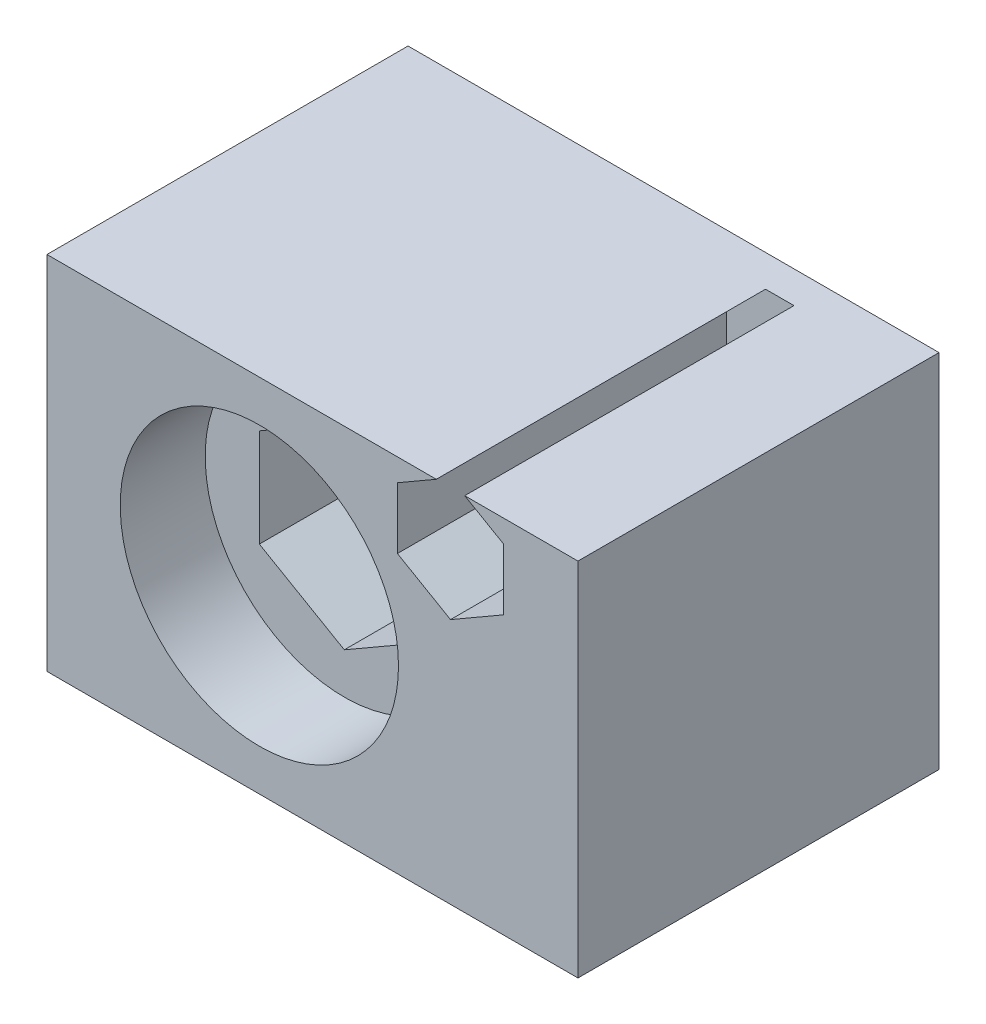
ISO-10303-21;
HEADER;
FILE_DESCRIPTION(('STEP AP214'),'2;1');
FILE_NAME('part.step','',(''),(''),'','','');
FILE_SCHEMA(('AUTOMOTIVE_DESIGN { 1 0 10303 214 1 1 1 1 }'));
ENDSEC;
DATA;
#1=APPLICATION_CONTEXT('core data for automotive mechanical design processes');
#2=APPLICATION_PROTOCOL_DEFINITION('international standard','automotive_design',2000,#1);
#3=PRODUCT_CONTEXT('',#1,'mechanical');
#4=PRODUCT('Part','Part','',(#3));
#5=PRODUCT_RELATED_PRODUCT_CATEGORY('part','',(#4));
#6=PRODUCT_DEFINITION_FORMATION('','',#4);
#7=PRODUCT_DEFINITION_CONTEXT('part definition',#1,'design');
#8=PRODUCT_DEFINITION('design','',#6,#7);
#9=PRODUCT_DEFINITION_SHAPE('','',#8);
#10=(LENGTH_UNIT() NAMED_UNIT(*) SI_UNIT(.MILLI.,.METRE.));
#11=(NAMED_UNIT(*) PLANE_ANGLE_UNIT() SI_UNIT($,.RADIAN.));
#12=(NAMED_UNIT(*) SI_UNIT($,.STERADIAN.) SOLID_ANGLE_UNIT());
#13=UNCERTAINTY_MEASURE_WITH_UNIT(LENGTH_MEASURE(1.E-05),#10,'distance_accuracy_value','');
#14=(GEOMETRIC_REPRESENTATION_CONTEXT(3) GLOBAL_UNCERTAINTY_ASSIGNED_CONTEXT((#13)) GLOBAL_UNIT_ASSIGNED_CONTEXT((#10,
#11,#12)) REPRESENTATION_CONTEXT('',''));
#15=CARTESIAN_POINT('',(0.,0.,0.));
#16=DIRECTION('',(0.,0.,1.));
#17=DIRECTION('',(1.,0.,0.));
#18=AXIS2_PLACEMENT_3D('',#15,#16,#17);
#19=CARTESIAN_POINT('',(10.,9.,-4.5));
#20=DIRECTION('',(0.,0.,1.));
#21=DIRECTION('',(1.,0.,0.));
#22=AXIS2_PLACEMENT_3D('',#19,#20,#21);
#23=CYLINDRICAL_SURFACE('',#22,6.55);
#24=CARTESIAN_POINT('',(10.,9.,-4.5));
#25=DIRECTION('',(0.,0.,1.));
#26=DIRECTION('',(1.,0.,0.));
#27=AXIS2_PLACEMENT_3D('',#24,#25,#26);
#28=CIRCLE('',#27,6.55);
#29=CARTESIAN_POINT('',(16.55,9.,-4.5));
#30=VERTEX_POINT('',#29);
#31=EDGE_CURVE('E284',#30,#30,#28,.T.);
#32=ORIENTED_EDGE('',*,*,#31,.F.);
#33=EDGE_LOOP('',(#32));
#34=FACE_BOUND('',#33,.T.);
#35=CARTESIAN_POINT('',(10.,9.,-0.499999999999999));
#36=DIRECTION('',(0.,0.,1.));
#37=DIRECTION('',(0.,-1.,0.));
#38=AXIS2_PLACEMENT_3D('',#35,#36,#37);
#39=CIRCLE('',#38,6.55);
#40=CARTESIAN_POINT('',(10.,2.45,-0.499999999999997));
#41=VERTEX_POINT('',#40);
#42=EDGE_CURVE('E207',#41,#41,#39,.F.);
#43=ORIENTED_EDGE('',*,*,#42,.F.);
#44=EDGE_LOOP('',(#43));
#45=FACE_BOUND('',#44,.T.);
#46=ADVANCED_FACE('F37',(#34,#45),#23,.F.);
#47=CARTESIAN_POINT('',(10.,9.,-4.5));
#48=DIRECTION('',(0.,0.,1.));
#49=DIRECTION('',(1.,0.,0.));
#50=AXIS2_PLACEMENT_3D('',#47,#48,#49);
#51=PLANE('',#50);
#52=DIRECTION('',(-0.866025403784439,0.5,0.));
#53=VECTOR('',#52,1.);
#54=CARTESIAN_POINT('',(14.,11.3094010767585,-4.5));
#55=LINE('',#54,#53);
#56=CARTESIAN_POINT('',(14.,11.3094010767585,-4.5));
#57=VERTEX_POINT('',#56);
#58=CARTESIAN_POINT('',(10.,13.618802153517,-4.5));
#59=VERTEX_POINT('',#58);
#60=EDGE_CURVE('E231',#57,#59,#55,.T.);
#61=ORIENTED_EDGE('',*,*,#60,.F.);
#62=DIRECTION('',(0.,1.,0.));
#63=VECTOR('',#62,1.);
#64=CARTESIAN_POINT('',(14.,6.6905989232415,-4.5));
#65=LINE('',#64,#63);
#66=CARTESIAN_POINT('',(14.,6.6905989232415,-4.5));
#67=VERTEX_POINT('',#66);
#68=EDGE_CURVE('E268',#67,#57,#65,.T.);
#69=ORIENTED_EDGE('',*,*,#68,.F.);
#70=DIRECTION('',(0.866025403784439,0.5,0.));
#71=VECTOR('',#70,1.);
#72=CARTESIAN_POINT('',(10.,4.381197846483,-4.5));
#73=LINE('',#72,#71);
#74=CARTESIAN_POINT('',(10.,4.381197846483,-4.5));
#75=VERTEX_POINT('',#74);
#76=EDGE_CURVE('E265',#75,#67,#73,.T.);
#77=ORIENTED_EDGE('',*,*,#76,.F.);
#78=DIRECTION('',(0.866025403784439,-0.5,0.));
#79=VECTOR('',#78,1.);
#80=CARTESIAN_POINT('',(6.,6.6905989232415,-4.5));
#81=LINE('',#80,#79);
#82=CARTESIAN_POINT('',(6.,6.6905989232415,-4.5));
#83=VERTEX_POINT('',#82);
#84=EDGE_CURVE('E262',#83,#75,#81,.T.);
#85=ORIENTED_EDGE('',*,*,#84,.F.);
#86=DIRECTION('',(0.,-1.,0.));
#87=VECTOR('',#86,1.);
#88=CARTESIAN_POINT('',(6.,11.3094010767585,-4.5));
#89=LINE('',#88,#87);
#90=CARTESIAN_POINT('',(6.,11.3094010767585,-4.5));
#91=VERTEX_POINT('',#90);
#92=EDGE_CURVE('E259',#91,#83,#89,.T.);
#93=ORIENTED_EDGE('',*,*,#92,.F.);
#94=DIRECTION('',(-0.866025403784438,-0.5,0.));
#95=VECTOR('',#94,1.);
#96=CARTESIAN_POINT('',(10.,13.618802153517,-4.5));
#97=LINE('',#96,#95);
#98=EDGE_CURVE('E256',#59,#91,#97,.T.);
#99=ORIENTED_EDGE('',*,*,#98,.F.);
#100=EDGE_LOOP('',(#61,#69,#77,#85,#93,#99));
#101=FACE_BOUND('',#100,.T.);
#102=ORIENTED_EDGE('',*,*,#31,.T.);
#103=EDGE_LOOP('',(#102));
#104=FACE_BOUND('',#103,.T.);
#105=ADVANCED_FACE('F333',(#101,#104),#51,.T.);
#106=CARTESIAN_POINT('',(14.,11.3094010767585,-30.2202018532156));
#107=DIRECTION('',(0.5,0.866025403784439,0.));
#108=DIRECTION('',(-0.866025403784439,0.5,0.));
#109=AXIS2_PLACEMENT_3D('',#106,#107,#108);
#110=PLANE('',#109);
#111=DIRECTION('',(0.866025403784439,-0.5,0.));
#112=VECTOR('',#111,1.);
#113=CARTESIAN_POINT('',(14.,11.3094010767585,-16.2));
#114=LINE('',#113,#112);
#115=CARTESIAN_POINT('',(10.,13.618802153517,-16.2));
#116=VERTEX_POINT('',#115);
#117=CARTESIAN_POINT('',(14.,11.3094010767585,-16.2));
#118=VERTEX_POINT('',#117);
#119=EDGE_CURVE('E252',#116,#118,#114,.T.);
#120=ORIENTED_EDGE('',*,*,#119,.T.);
#121=DIRECTION('',(0.,0.,1.));
#122=VECTOR('',#121,1.);
#123=CARTESIAN_POINT('',(14.,11.3094010767585,-30.2202018532156));
#124=LINE('',#123,#122);
#125=EDGE_CURVE('E246',#118,#57,#124,.T.);
#126=ORIENTED_EDGE('',*,*,#125,.T.);
#127=ORIENTED_EDGE('',*,*,#60,.T.);
#128=DIRECTION('',(0.,0.,1.));
#129=VECTOR('',#128,1.);
#130=CARTESIAN_POINT('',(10.,13.618802153517,-30.2202018532156));
#131=LINE('',#130,#129);
#132=EDGE_CURVE('E271',#116,#59,#131,.T.);
#133=ORIENTED_EDGE('',*,*,#132,.F.);
#134=EDGE_LOOP('',(#120,#126,#127,#133));
#135=FACE_BOUND('',#134,.T.);
#136=ADVANCED_FACE('F339',(#135),#110,.F.);
#137=CARTESIAN_POINT('',(14.,6.6905989232415,-30.2202018532156));
#138=DIRECTION('',(1.,0.,0.));
#139=DIRECTION('',(0.,0.,-1.));
#140=AXIS2_PLACEMENT_3D('',#137,#138,#139);
#141=PLANE('',#140);
#142=DIRECTION('',(0.,-1.,0.));
#143=VECTOR('',#142,1.);
#144=CARTESIAN_POINT('',(14.,6.6905989232415,-16.2));
#145=LINE('',#144,#143);
#146=CARTESIAN_POINT('',(14.,6.6905989232415,-16.2));
#147=VERTEX_POINT('',#146);
#148=EDGE_CURVE('E250',#118,#147,#145,.T.);
#149=ORIENTED_EDGE('',*,*,#148,.T.);
#150=DIRECTION('',(0.,0.,1.));
#151=VECTOR('',#150,1.);
#152=CARTESIAN_POINT('',(14.,6.6905989232415,-30.2202018532156));
#153=LINE('',#152,#151);
#154=EDGE_CURVE('E273',#147,#67,#153,.T.);
#155=ORIENTED_EDGE('',*,*,#154,.T.);
#156=ORIENTED_EDGE('',*,*,#68,.T.);
#157=ORIENTED_EDGE('',*,*,#125,.F.);
#158=EDGE_LOOP('',(#149,#155,#156,#157));
#159=FACE_BOUND('',#158,.T.);
#160=ADVANCED_FACE('F489',(#159),#141,.F.);
#161=CARTESIAN_POINT('',(10.,4.381197846483,-30.2202018532156));
#162=DIRECTION('',(0.5,-0.866025403784439,0.));
#163=DIRECTION('',(0.866025403784439,0.5,0.));
#164=AXIS2_PLACEMENT_3D('',#161,#162,#163);
#165=PLANE('',#164);
#166=DIRECTION('',(-0.866025403784439,-0.5,0.));
#167=VECTOR('',#166,1.);
#168=CARTESIAN_POINT('',(10.,4.381197846483,-16.2));
#169=LINE('',#168,#167);
#170=CARTESIAN_POINT('',(10.,4.381197846483,-16.2));
#171=VERTEX_POINT('',#170);
#172=EDGE_CURVE('E248',#147,#171,#169,.T.);
#173=ORIENTED_EDGE('',*,*,#172,.T.);
#174=DIRECTION('',(0.,0.,1.));
#175=VECTOR('',#174,1.);
#176=CARTESIAN_POINT('',(10.,4.381197846483,-30.2202018532156));
#177=LINE('',#176,#175);
#178=EDGE_CURVE('E275',#171,#75,#177,.T.);
#179=ORIENTED_EDGE('',*,*,#178,.T.);
#180=ORIENTED_EDGE('',*,*,#76,.T.);
#181=ORIENTED_EDGE('',*,*,#154,.F.);
#182=EDGE_LOOP('',(#173,#179,#180,#181));
#183=FACE_BOUND('',#182,.T.);
#184=ADVANCED_FACE('F481',(#183),#165,.F.);
#185=CARTESIAN_POINT('',(6.,6.6905989232415,-30.2202018532156));
#186=DIRECTION('',(-0.5,-0.866025403784439,0.));
#187=DIRECTION('',(0.866025403784439,-0.5,0.));
#188=AXIS2_PLACEMENT_3D('',#185,#186,#187);
#189=PLANE('',#188);
#190=DIRECTION('',(-0.866025403784439,0.5,0.));
#191=VECTOR('',#190,1.);
#192=CARTESIAN_POINT('',(6.,6.6905989232415,-16.2));
#193=LINE('',#192,#191);
#194=CARTESIAN_POINT('',(6.,6.6905989232415,-16.2));
#195=VERTEX_POINT('',#194);
#196=EDGE_CURVE('E245',#171,#195,#193,.T.);
#197=ORIENTED_EDGE('',*,*,#196,.T.);
#198=DIRECTION('',(0.,0.,1.));
#199=VECTOR('',#198,1.);
#200=CARTESIAN_POINT('',(6.,6.6905989232415,-30.2202018532156));
#201=LINE('',#200,#199);
#202=EDGE_CURVE('E277',#195,#83,#201,.T.);
#203=ORIENTED_EDGE('',*,*,#202,.T.);
#204=ORIENTED_EDGE('',*,*,#84,.T.);
#205=ORIENTED_EDGE('',*,*,#178,.F.);
#206=EDGE_LOOP('',(#197,#203,#204,#205));
#207=FACE_BOUND('',#206,.T.);
#208=ADVANCED_FACE('F473',(#207),#189,.F.);
#209=CARTESIAN_POINT('',(6.,11.3094010767585,-30.2202018532156));
#210=DIRECTION('',(-1.,0.,0.));
#211=DIRECTION('',(0.,0.,1.));
#212=AXIS2_PLACEMENT_3D('',#209,#210,#211);
#213=PLANE('',#212);
#214=DIRECTION('',(0.,1.,0.));
#215=VECTOR('',#214,1.);
#216=CARTESIAN_POINT('',(6.,11.3094010767585,-16.2));
#217=LINE('',#216,#215);
#218=CARTESIAN_POINT('',(6.,11.3094010767585,-16.2));
#219=VERTEX_POINT('',#218);
#220=EDGE_CURVE('E243',#195,#219,#217,.T.);
#221=ORIENTED_EDGE('',*,*,#220,.T.);
#222=DIRECTION('',(0.,0.,1.));
#223=VECTOR('',#222,1.);
#224=CARTESIAN_POINT('',(6.,11.3094010767585,-30.2202018532156));
#225=LINE('',#224,#223);
#226=EDGE_CURVE('E279',#219,#91,#225,.T.);
#227=ORIENTED_EDGE('',*,*,#226,.T.);
#228=ORIENTED_EDGE('',*,*,#92,.T.);
#229=ORIENTED_EDGE('',*,*,#202,.F.);
#230=EDGE_LOOP('',(#221,#227,#228,#229));
#231=FACE_BOUND('',#230,.T.);
#232=ADVANCED_FACE('F466',(#231),#213,.F.);
#233=CARTESIAN_POINT('',(10.,13.618802153517,-30.2202018532156));
#234=DIRECTION('',(-0.5,0.866025403784438,0.));
#235=DIRECTION('',(-0.866025403784438,-0.5,0.));
#236=AXIS2_PLACEMENT_3D('',#233,#234,#235);
#237=PLANE('',#236);
#238=DIRECTION('',(0.866025403784438,0.5,0.));
#239=VECTOR('',#238,1.);
#240=CARTESIAN_POINT('',(10.,13.618802153517,-16.2));
#241=LINE('',#240,#239);
#242=EDGE_CURVE('E254',#219,#116,#241,.T.);
#243=ORIENTED_EDGE('',*,*,#242,.T.);
#244=ORIENTED_EDGE('',*,*,#132,.T.);
#245=ORIENTED_EDGE('',*,*,#98,.T.);
#246=ORIENTED_EDGE('',*,*,#226,.F.);
#247=EDGE_LOOP('',(#243,#244,#245,#246));
#248=FACE_BOUND('',#247,.T.);
#249=ADVANCED_FACE('F458',(#248),#237,.F.);
#250=CARTESIAN_POINT('',(25.,0.,-16.2));
#251=DIRECTION('',(0.,0.,1.));
#252=DIRECTION('',(1.,0.,0.));
#253=AXIS2_PLACEMENT_3D('',#250,#251,#252);
#254=PLANE('',#253);
#255=ORIENTED_EDGE('',*,*,#119,.F.);
#256=ORIENTED_EDGE('',*,*,#242,.F.);
#257=ORIENTED_EDGE('',*,*,#220,.F.);
#258=ORIENTED_EDGE('',*,*,#196,.F.);
#259=ORIENTED_EDGE('',*,*,#172,.F.);
#260=ORIENTED_EDGE('',*,*,#148,.F.);
#261=EDGE_LOOP('',(#255,#256,#257,#258,#259,#260));
#262=FACE_BOUND('',#261,.T.);
#263=ADVANCED_FACE('F438',(#262),#254,.T.);
#264=CARTESIAN_POINT('',(25.,17.5,-0.5));
#265=DIRECTION('',(0.,0.,1.));
#266=DIRECTION('',(0.,-1.,0.));
#267=AXIS2_PLACEMENT_3D('',#264,#265,#266);
#268=PLANE('',#267);
#269=DIRECTION('',(0.866025403784439,-0.5,0.));
#270=VECTOR('',#269,1.);
#271=CARTESIAN_POINT('',(21.5000000000016,16.4433756729741,-0.5));
#272=LINE('',#271,#270);
#273=CARTESIAN_POINT('',(19.6698729810795,17.5,-0.500000000000001));
#274=VERTEX_POINT('',#273);
#275=CARTESIAN_POINT('',(21.5000000000016,16.4433756729741,-0.500000000000001));
#276=VERTEX_POINT('',#275);
#277=EDGE_CURVE('E205',#274,#276,#272,.T.);
#278=ORIENTED_EDGE('',*,*,#277,.T.);
#279=DIRECTION('',(0.,-1.,0.));
#280=VECTOR('',#279,1.);
#281=CARTESIAN_POINT('',(21.5000000000016,13.556624327026,-0.5));
#282=LINE('',#281,#280);
#283=CARTESIAN_POINT('',(21.5000000000016,13.556624327026,-0.499999999999999));
#284=VERTEX_POINT('',#283);
#285=EDGE_CURVE('E203',#276,#284,#282,.T.);
#286=ORIENTED_EDGE('',*,*,#285,.T.);
#287=DIRECTION('',(-0.866025403784438,-0.5,0.));
#288=VECTOR('',#287,1.);
#289=CARTESIAN_POINT('',(19.0000000000016,12.1132486540519,-0.499999999999999));
#290=LINE('',#289,#288);
#291=CARTESIAN_POINT('',(19.0000000000016,12.1132486540519,-0.5));
#292=VERTEX_POINT('',#291);
#293=EDGE_CURVE('E201',#284,#292,#290,.T.);
#294=ORIENTED_EDGE('',*,*,#293,.T.);
#295=DIRECTION('',(-0.866025403784439,0.5,0.));
#296=VECTOR('',#295,1.);
#297=CARTESIAN_POINT('',(16.5000000000016,13.556624327026,-0.5));
#298=LINE('',#297,#296);
#299=CARTESIAN_POINT('',(16.5000000000016,13.556624327026,-0.5));
#300=VERTEX_POINT('',#299);
#301=EDGE_CURVE('E199',#292,#300,#298,.T.);
#302=ORIENTED_EDGE('',*,*,#301,.T.);
#303=DIRECTION('',(0.,1.,0.));
#304=VECTOR('',#303,1.);
#305=CARTESIAN_POINT('',(16.5000000000016,16.4433756729741,-0.5));
#306=LINE('',#305,#304);
#307=CARTESIAN_POINT('',(16.5000000000016,16.4433756729741,-0.5));
#308=VERTEX_POINT('',#307);
#309=EDGE_CURVE('E197',#300,#308,#306,.T.);
#310=ORIENTED_EDGE('',*,*,#309,.T.);
#311=DIRECTION('',(0.866025403784438,0.500000000000001,0.));
#312=VECTOR('',#311,1.);
#313=CARTESIAN_POINT('',(19.0000000000016,17.8867513459482,-0.5));
#314=LINE('',#313,#312);
#315=CARTESIAN_POINT('',(18.3301270189237,17.5,-0.5));
#316=VERTEX_POINT('',#315);
#317=EDGE_CURVE('E12',#308,#316,#314,.T.);
#318=ORIENTED_EDGE('',*,*,#317,.T.);
#319=DIRECTION('',(-1.,0.,0.));
#320=VECTOR('',#319,1.);
#321=CARTESIAN_POINT('',(25.,17.5,-0.5));
#322=LINE('',#321,#320);
#323=CARTESIAN_POINT('',(0.,17.5,-0.5));
#324=VERTEX_POINT('',#323);
#325=EDGE_CURVE('E164',#316,#324,#322,.T.);
#326=ORIENTED_EDGE('',*,*,#325,.T.);
#327=DIRECTION('',(0.,1.,0.));
#328=VECTOR('',#327,1.);
#329=CARTESIAN_POINT('',(0.,17.5,-0.5));
#330=LINE('',#329,#328);
#331=CARTESIAN_POINT('',(0.,0.5,-0.499999999999997));
#332=VERTEX_POINT('',#331);
#333=EDGE_CURVE('E60',#332,#324,#330,.T.);
#334=ORIENTED_EDGE('',*,*,#333,.F.);
#335=DIRECTION('',(-1.,0.,0.));
#336=VECTOR('',#335,1.);
#337=CARTESIAN_POINT('',(25.,0.5,-0.499999999999997));
#338=LINE('',#337,#336);
#339=CARTESIAN_POINT('',(25.,0.5,-0.499999999999997));
#340=VERTEX_POINT('',#339);
#341=EDGE_CURVE('E170',#340,#332,#338,.T.);
#342=ORIENTED_EDGE('',*,*,#341,.F.);
#343=DIRECTION('',(0.,1.,0.));
#344=VECTOR('',#343,1.);
#345=CARTESIAN_POINT('',(25.,17.5,-0.5));
#346=LINE('',#345,#344);
#347=CARTESIAN_POINT('',(25.,17.5,-0.5));
#348=VERTEX_POINT('',#347);
#349=EDGE_CURVE('E167',#340,#348,#346,.T.);
#350=ORIENTED_EDGE('',*,*,#349,.T.);
#351=EDGE_CURVE('E155',#348,#274,#322,.T.);
#352=ORIENTED_EDGE('',*,*,#351,.T.);
#353=EDGE_LOOP('',(#278,#286,#294,#302,#310,#318,#326,#334,#342,#350,#352));
#354=FACE_BOUND('',#353,.T.);
#355=ORIENTED_EDGE('',*,*,#42,.T.);
#356=EDGE_LOOP('',(#355));
#357=FACE_BOUND('',#356,.T.);
#358=ADVANCED_FACE('F168',(#354,#357),#268,.T.);
#359=CARTESIAN_POINT('',(25.,17.5,-17.5));
#360=DIRECTION('',(0.,1.,0.));
#361=DIRECTION('',(0.,0.,1.));
#362=AXIS2_PLACEMENT_3D('',#359,#360,#361);
#363=PLANE('',#362);
#364=DIRECTION('',(0.,0.,1.));
#365=VECTOR('',#364,1.);
#366=CARTESIAN_POINT('',(19.6698729810795,17.5,-16.));
#367=LINE('',#366,#365);
#368=CARTESIAN_POINT('',(19.6698729810795,17.5,-16.));
#369=VERTEX_POINT('',#368);
#370=EDGE_CURVE('E161',#369,#274,#367,.T.);
#371=ORIENTED_EDGE('',*,*,#370,.T.);
#372=ORIENTED_EDGE('',*,*,#351,.F.);
#373=DIRECTION('',(0.,0.,-1.));
#374=VECTOR('',#373,1.);
#375=CARTESIAN_POINT('',(25.,17.5,-17.5));
#376=LINE('',#375,#374);
#377=CARTESIAN_POINT('',(25.,17.5,-17.5));
#378=VERTEX_POINT('',#377);
#379=EDGE_CURVE('E159',#348,#378,#376,.T.);
#380=ORIENTED_EDGE('',*,*,#379,.T.);
#381=DIRECTION('',(-1.,0.,0.));
#382=VECTOR('',#381,1.);
#383=CARTESIAN_POINT('',(25.,17.5,-17.5));
#384=LINE('',#383,#382);
#385=CARTESIAN_POINT('',(0.,17.5,-17.5));
#386=VERTEX_POINT('',#385);
#387=EDGE_CURVE('E163',#378,#386,#384,.T.);
#388=ORIENTED_EDGE('',*,*,#387,.T.);
#389=DIRECTION('',(0.,0.,-1.));
#390=VECTOR('',#389,1.);
#391=CARTESIAN_POINT('',(0.,17.5,-17.5));
#392=LINE('',#391,#390);
#393=EDGE_CURVE('E189',#324,#386,#392,.T.);
#394=ORIENTED_EDGE('',*,*,#393,.F.);
#395=ORIENTED_EDGE('',*,*,#325,.F.);
#396=DIRECTION('',(0.,0.,-1.));
#397=VECTOR('',#396,1.);
#398=CARTESIAN_POINT('',(18.3301270189238,17.5,-16.));
#399=LINE('',#398,#397);
#400=CARTESIAN_POINT('',(18.3301270189238,17.5,-16.));
#401=VERTEX_POINT('',#400);
#402=EDGE_CURVE('E192',#316,#401,#399,.T.);
#403=ORIENTED_EDGE('',*,*,#402,.T.);
#404=DIRECTION('',(-1.,0.,0.));
#405=VECTOR('',#404,1.);
#406=CARTESIAN_POINT('',(0.,17.5,-16.));
#407=LINE('',#406,#405);
#408=EDGE_CURVE('E45',#369,#401,#407,.T.);
#409=ORIENTED_EDGE('',*,*,#408,.F.);
#410=EDGE_LOOP('',(#371,#372,#380,#388,#394,#395,#403,#409));
#411=FACE_BOUND('',#410,.T.);
#412=ADVANCED_FACE('F157',(#411),#363,.T.);
#413=CARTESIAN_POINT('',(25.,17.5,-17.5));
#414=DIRECTION('',(0.,0.,-1.));
#415=DIRECTION('',(0.,1.,0.));
#416=AXIS2_PLACEMENT_3D('',#413,#414,#415);
#417=PLANE('',#416);
#418=DIRECTION('',(0.,-1.,0.));
#419=VECTOR('',#418,1.);
#420=CARTESIAN_POINT('',(0.,17.5,-17.5));
#421=LINE('',#420,#419);
#422=CARTESIAN_POINT('',(0.,0.5,-17.5));
#423=VERTEX_POINT('',#422);
#424=EDGE_CURVE('E182',#386,#423,#421,.T.);
#425=ORIENTED_EDGE('',*,*,#424,.F.);
#426=ORIENTED_EDGE('',*,*,#387,.F.);
#427=DIRECTION('',(0.,-1.,0.));
#428=VECTOR('',#427,1.);
#429=CARTESIAN_POINT('',(25.,17.5,-17.5));
#430=LINE('',#429,#428);
#431=CARTESIAN_POINT('',(25.,0.5,-17.5));
#432=VERTEX_POINT('',#431);
#433=EDGE_CURVE('E52',#378,#432,#430,.T.);
#434=ORIENTED_EDGE('',*,*,#433,.T.);
#435=DIRECTION('',(-1.,0.,0.));
#436=VECTOR('',#435,1.);
#437=CARTESIAN_POINT('',(25.,0.5,-17.5));
#438=LINE('',#437,#436);
#439=EDGE_CURVE('E177',#432,#423,#438,.T.);
#440=ORIENTED_EDGE('',*,*,#439,.T.);
#441=EDGE_LOOP('',(#425,#426,#434,#440));
#442=FACE_BOUND('',#441,.T.);
#443=ADVANCED_FACE('F322',(#442),#417,.T.);
#444=CARTESIAN_POINT('',(25.,0.5,-17.5));
#445=DIRECTION('',(0.,-1.,0.));
#446=DIRECTION('',(0.,0.,-1.));
#447=AXIS2_PLACEMENT_3D('',#444,#445,#446);
#448=PLANE('',#447);
#449=DIRECTION('',(0.,0.,1.));
#450=VECTOR('',#449,1.);
#451=CARTESIAN_POINT('',(0.,0.5,-17.5));
#452=LINE('',#451,#450);
#453=EDGE_CURVE('E185',#423,#332,#452,.T.);
#454=ORIENTED_EDGE('',*,*,#453,.F.);
#455=ORIENTED_EDGE('',*,*,#439,.F.);
#456=DIRECTION('',(0.,0.,1.));
#457=VECTOR('',#456,1.);
#458=CARTESIAN_POINT('',(25.,0.5,-17.5));
#459=LINE('',#458,#457);
#460=EDGE_CURVE('E174',#432,#340,#459,.T.);
#461=ORIENTED_EDGE('',*,*,#460,.T.);
#462=ORIENTED_EDGE('',*,*,#341,.T.);
#463=EDGE_LOOP('',(#454,#455,#461,#462));
#464=FACE_BOUND('',#463,.T.);
#465=ADVANCED_FACE('F320',(#464),#448,.T.);
#466=CARTESIAN_POINT('',(0.,0.,0.));
#467=DIRECTION('',(-1.,0.,0.));
#468=DIRECTION('',(0.,0.,1.));
#469=AXIS2_PLACEMENT_3D('',#466,#467,#468);
#470=PLANE('',#469);
#471=ORIENTED_EDGE('',*,*,#393,.T.);
#472=ORIENTED_EDGE('',*,*,#424,.T.);
#473=ORIENTED_EDGE('',*,*,#453,.T.);
#474=ORIENTED_EDGE('',*,*,#333,.T.);
#475=EDGE_LOOP('',(#471,#472,#473,#474));
#476=FACE_BOUND('',#475,.T.);
#477=ADVANCED_FACE('F39',(#476),#470,.T.);
#478=CARTESIAN_POINT('',(25.,0.,0.));
#479=DIRECTION('',(-1.,0.,0.));
#480=DIRECTION('',(0.,0.,1.));
#481=AXIS2_PLACEMENT_3D('',#478,#479,#480);
#482=PLANE('',#481);
#483=ORIENTED_EDGE('',*,*,#433,.F.);
#484=ORIENTED_EDGE('',*,*,#379,.F.);
#485=ORIENTED_EDGE('',*,*,#349,.F.);
#486=ORIENTED_EDGE('',*,*,#460,.F.);
#487=EDGE_LOOP('',(#483,#484,#485,#486));
#488=FACE_BOUND('',#487,.T.);
#489=ADVANCED_FACE('F176',(#488),#482,.F.);
#490=CARTESIAN_POINT('',(0.,0.,-16.));
#491=DIRECTION('',(0.,0.,1.));
#492=DIRECTION('',(1.,0.,0.));
#493=AXIS2_PLACEMENT_3D('',#490,#491,#492);
#494=PLANE('',#493);
#495=DIRECTION('',(-0.866025403784439,0.5,0.));
#496=VECTOR('',#495,1.);
#497=CARTESIAN_POINT('',(21.5000000000016,16.4433756729741,-16.));
#498=LINE('',#497,#496);
#499=CARTESIAN_POINT('',(21.5000000000016,16.4433756729741,-16.));
#500=VERTEX_POINT('',#499);
#501=EDGE_CURVE('E210',#500,#369,#498,.T.);
#502=ORIENTED_EDGE('',*,*,#501,.T.);
#503=ORIENTED_EDGE('',*,*,#408,.T.);
#504=DIRECTION('',(-0.866025403784438,-0.500000000000001,0.));
#505=VECTOR('',#504,1.);
#506=CARTESIAN_POINT('',(19.0000000000016,17.8867513459482,-16.));
#507=LINE('',#506,#505);
#508=CARTESIAN_POINT('',(16.5000000000016,16.4433756729741,-16.));
#509=VERTEX_POINT('',#508);
#510=EDGE_CURVE('E213',#401,#509,#507,.T.);
#511=ORIENTED_EDGE('',*,*,#510,.T.);
#512=DIRECTION('',(0.,-1.,0.));
#513=VECTOR('',#512,1.);
#514=CARTESIAN_POINT('',(16.5000000000016,16.4433756729741,-16.));
#515=LINE('',#514,#513);
#516=CARTESIAN_POINT('',(16.5000000000016,13.556624327026,-16.));
#517=VERTEX_POINT('',#516);
#518=EDGE_CURVE('E215',#509,#517,#515,.T.);
#519=ORIENTED_EDGE('',*,*,#518,.T.);
#520=DIRECTION('',(0.866025403784439,-0.5,0.));
#521=VECTOR('',#520,1.);
#522=CARTESIAN_POINT('',(16.5000000000016,13.556624327026,-16.));
#523=LINE('',#522,#521);
#524=CARTESIAN_POINT('',(19.0000000000016,12.1132486540519,-16.));
#525=VERTEX_POINT('',#524);
#526=EDGE_CURVE('E218',#517,#525,#523,.T.);
#527=ORIENTED_EDGE('',*,*,#526,.T.);
#528=DIRECTION('',(0.866025403784438,0.5,0.));
#529=VECTOR('',#528,1.);
#530=CARTESIAN_POINT('',(19.0000000000016,12.1132486540519,-16.));
#531=LINE('',#530,#529);
#532=CARTESIAN_POINT('',(21.5000000000016,13.556624327026,-16.));
#533=VERTEX_POINT('',#532);
#534=EDGE_CURVE('E221',#525,#533,#531,.T.);
#535=ORIENTED_EDGE('',*,*,#534,.T.);
#536=DIRECTION('',(0.,1.,0.));
#537=VECTOR('',#536,1.);
#538=CARTESIAN_POINT('',(21.5000000000016,13.556624327026,-16.));
#539=LINE('',#538,#537);
#540=EDGE_CURVE('E224',#533,#500,#539,.T.);
#541=ORIENTED_EDGE('',*,*,#540,.T.);
#542=EDGE_LOOP('',(#502,#503,#511,#519,#527,#535,#541));
#543=FACE_BOUND('',#542,.T.);
#544=ADVANCED_FACE('F289',(#543),#494,.T.);
#545=CARTESIAN_POINT('',(19.0000000000016,17.8867513459482,-16.));
#546=DIRECTION('',(-0.500000000000001,0.866025403784438,0.));
#547=DIRECTION('',(-0.866025403784438,-0.500000000000001,0.));
#548=AXIS2_PLACEMENT_3D('',#545,#546,#547);
#549=PLANE('',#548);
#550=ORIENTED_EDGE('',*,*,#402,.F.);
#551=ORIENTED_EDGE('',*,*,#317,.F.);
#552=DIRECTION('',(0.,0.,1.));
#553=VECTOR('',#552,1.);
#554=CARTESIAN_POINT('',(16.5000000000016,16.4433756729741,-16.));
#555=LINE('',#554,#553);
#556=EDGE_CURVE('E227',#509,#308,#555,.T.);
#557=ORIENTED_EDGE('',*,*,#556,.F.);
#558=ORIENTED_EDGE('',*,*,#510,.F.);
#559=EDGE_LOOP('',(#550,#551,#557,#558));
#560=FACE_BOUND('',#559,.T.);
#561=ADVANCED_FACE('F294',(#560),#549,.F.);
#562=CARTESIAN_POINT('',(16.5000000000016,16.4433756729741,-16.));
#563=DIRECTION('',(-1.,0.,0.));
#564=DIRECTION('',(0.,0.,1.));
#565=AXIS2_PLACEMENT_3D('',#562,#563,#564);
#566=PLANE('',#565);
#567=ORIENTED_EDGE('',*,*,#309,.F.);
#568=DIRECTION('',(0.,0.,1.));
#569=VECTOR('',#568,1.);
#570=CARTESIAN_POINT('',(16.5000000000016,13.556624327026,-16.));
#571=LINE('',#570,#569);
#572=EDGE_CURVE('E238',#517,#300,#571,.T.);
#573=ORIENTED_EDGE('',*,*,#572,.F.);
#574=ORIENTED_EDGE('',*,*,#518,.F.);
#575=ORIENTED_EDGE('',*,*,#556,.T.);
#576=EDGE_LOOP('',(#567,#573,#574,#575));
#577=FACE_BOUND('',#576,.T.);
#578=ADVANCED_FACE('F299',(#577),#566,.F.);
#579=CARTESIAN_POINT('',(16.5000000000016,13.556624327026,-16.));
#580=DIRECTION('',(-0.5,-0.866025403784439,0.));
#581=DIRECTION('',(0.866025403784439,-0.5,0.));
#582=AXIS2_PLACEMENT_3D('',#579,#580,#581);
#583=PLANE('',#582);
#584=ORIENTED_EDGE('',*,*,#301,.F.);
#585=DIRECTION('',(0.,0.,1.));
#586=VECTOR('',#585,1.);
#587=CARTESIAN_POINT('',(19.0000000000016,12.1132486540519,-16.));
#588=LINE('',#587,#586);
#589=EDGE_CURVE('E235',#525,#292,#588,.T.);
#590=ORIENTED_EDGE('',*,*,#589,.F.);
#591=ORIENTED_EDGE('',*,*,#526,.F.);
#592=ORIENTED_EDGE('',*,*,#572,.T.);
#593=EDGE_LOOP('',(#584,#590,#591,#592));
#594=FACE_BOUND('',#593,.T.);
#595=ADVANCED_FACE('F305',(#594),#583,.F.);
#596=CARTESIAN_POINT('',(19.0000000000016,12.1132486540519,-16.));
#597=DIRECTION('',(0.5,-0.866025403784438,0.));
#598=DIRECTION('',(0.866025403784438,0.5,0.));
#599=AXIS2_PLACEMENT_3D('',#596,#597,#598);
#600=PLANE('',#599);
#601=ORIENTED_EDGE('',*,*,#293,.F.);
#602=DIRECTION('',(0.,0.,1.));
#603=VECTOR('',#602,1.);
#604=CARTESIAN_POINT('',(21.5000000000016,13.556624327026,-16.));
#605=LINE('',#604,#603);
#606=EDGE_CURVE('E232',#533,#284,#605,.T.);
#607=ORIENTED_EDGE('',*,*,#606,.F.);
#608=ORIENTED_EDGE('',*,*,#534,.F.);
#609=ORIENTED_EDGE('',*,*,#589,.T.);
#610=EDGE_LOOP('',(#601,#607,#608,#609));
#611=FACE_BOUND('',#610,.T.);
#612=ADVANCED_FACE('F308',(#611),#600,.F.);
#613=CARTESIAN_POINT('',(21.5000000000016,13.556624327026,-16.));
#614=DIRECTION('',(1.,0.,0.));
#615=DIRECTION('',(0.,0.,-1.));
#616=AXIS2_PLACEMENT_3D('',#613,#614,#615);
#617=PLANE('',#616);
#618=ORIENTED_EDGE('',*,*,#285,.F.);
#619=DIRECTION('',(0.,0.,1.));
#620=VECTOR('',#619,1.);
#621=CARTESIAN_POINT('',(21.5000000000016,16.4433756729741,-16.));
#622=LINE('',#621,#620);
#623=EDGE_CURVE('E228',#500,#276,#622,.T.);
#624=ORIENTED_EDGE('',*,*,#623,.F.);
#625=ORIENTED_EDGE('',*,*,#540,.F.);
#626=ORIENTED_EDGE('',*,*,#606,.T.);
#627=EDGE_LOOP('',(#618,#624,#625,#626));
#628=FACE_BOUND('',#627,.T.);
#629=ADVANCED_FACE('F311',(#628),#617,.F.);
#630=CARTESIAN_POINT('',(21.5000000000016,16.4433756729741,-16.));
#631=DIRECTION('',(0.5,0.866025403784439,0.));
#632=DIRECTION('',(-0.866025403784439,0.5,0.));
#633=AXIS2_PLACEMENT_3D('',#630,#631,#632);
#634=PLANE('',#633);
#635=ORIENTED_EDGE('',*,*,#370,.F.);
#636=ORIENTED_EDGE('',*,*,#501,.F.);
#637=ORIENTED_EDGE('',*,*,#623,.T.);
#638=ORIENTED_EDGE('',*,*,#277,.F.);
#639=EDGE_LOOP('',(#635,#636,#637,#638));
#640=FACE_BOUND('',#639,.T.);
#641=ADVANCED_FACE('F313',(#640),#634,.F.);
#642=CLOSED_SHELL('',(#46,#105,#136,#160,#184,#208,#232,#249,#263,#358,#412,#443,#465,#477,#489,
#544,#561,#578,#595,#612,#629,#641));
#643=MANIFOLD_SOLID_BREP('B2',#642);
#644=ADVANCED_BREP_SHAPE_REPRESENTATION('',(#18,#643),#14);
#645=SHAPE_DEFINITION_REPRESENTATION(#9,#644);
ENDSEC;
END-ISO-10303-21;
